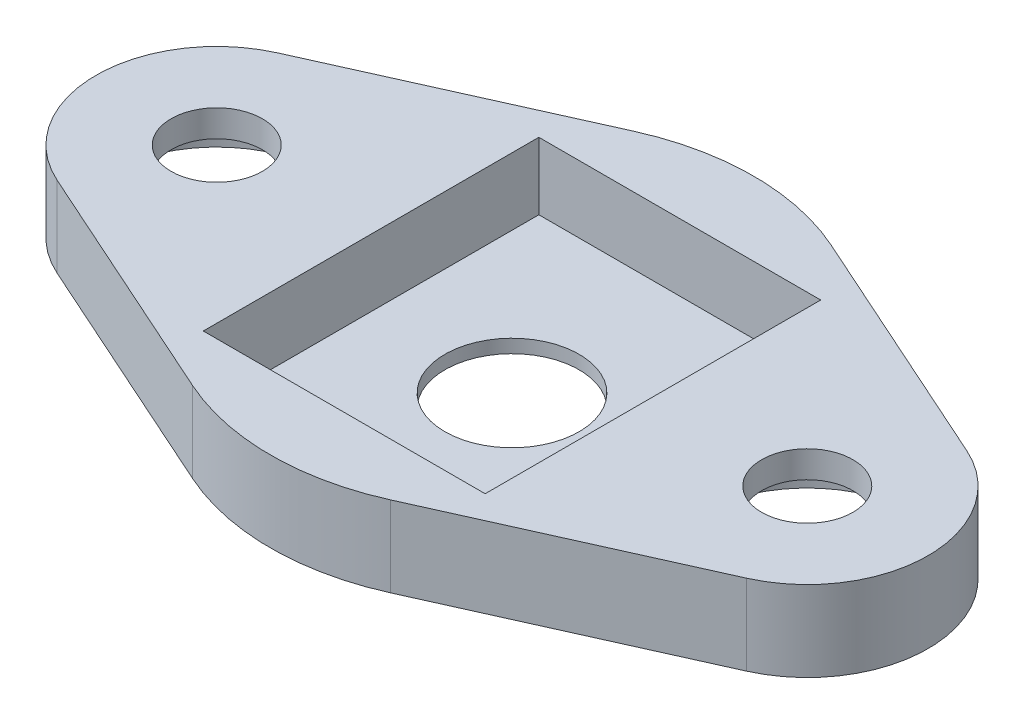
ISO-10303-21;
HEADER;
FILE_DESCRIPTION(('STEP AP214'),'2;1');
FILE_NAME('part.step','',(''),(''),'','','');
FILE_SCHEMA(('AUTOMOTIVE_DESIGN { 1 0 10303 214 1 1 1 1 }'));
ENDSEC;
DATA;
#1=APPLICATION_CONTEXT('core data for automotive mechanical design processes');
#2=APPLICATION_PROTOCOL_DEFINITION('international standard','automotive_design',2000,#1);
#3=PRODUCT_CONTEXT('',#1,'mechanical');
#4=PRODUCT('Part','Part','',(#3));
#5=PRODUCT_RELATED_PRODUCT_CATEGORY('part','',(#4));
#6=PRODUCT_DEFINITION_FORMATION('','',#4);
#7=PRODUCT_DEFINITION_CONTEXT('part definition',#1,'design');
#8=PRODUCT_DEFINITION('design','',#6,#7);
#9=PRODUCT_DEFINITION_SHAPE('','',#8);
#10=(LENGTH_UNIT() NAMED_UNIT(*) SI_UNIT(.MILLI.,.METRE.));
#11=(NAMED_UNIT(*) PLANE_ANGLE_UNIT() SI_UNIT($,.RADIAN.));
#12=(NAMED_UNIT(*) SI_UNIT($,.STERADIAN.) SOLID_ANGLE_UNIT());
#13=UNCERTAINTY_MEASURE_WITH_UNIT(LENGTH_MEASURE(1.E-05),#10,'distance_accuracy_value','');
#14=(GEOMETRIC_REPRESENTATION_CONTEXT(3) GLOBAL_UNCERTAINTY_ASSIGNED_CONTEXT((#13)) GLOBAL_UNIT_ASSIGNED_CONTEXT((#10,
#11,#12)) REPRESENTATION_CONTEXT('',''));
#15=CARTESIAN_POINT('',(0.,0.,0.));
#16=DIRECTION('',(0.,0.,1.));
#17=DIRECTION('',(1.,0.,0.));
#18=AXIS2_PLACEMENT_3D('',#15,#16,#17);
#19=CARTESIAN_POINT('',(-3.68181818181818,3.,-8.21244268631648));
#20=DIRECTION('',(0.409090909090909,0.,0.912493631812942));
#21=DIRECTION('',(0.912493631812942,0.,-0.409090909090909));
#22=AXIS2_PLACEMENT_3D('',#19,#20,#21);
#23=PLANE('',#22);
#24=DIRECTION('',(-0.912493631812942,0.,0.409090909090909));
#25=VECTOR('',#24,1.);
#26=CARTESIAN_POINT('',(-3.68181818181818,0.,-8.21244268631648));
#27=LINE('',#26,#25);
#28=CARTESIAN_POINT('',(-3.68181818181818,0.,-8.21244268631648));
#29=VERTEX_POINT('',#28);
#30=CARTESIAN_POINT('',(-12.8409090909091,0.,-4.10622134315824));
#31=VERTEX_POINT('',#30);
#32=EDGE_CURVE('E279',#29,#31,#27,.T.);
#33=ORIENTED_EDGE('',*,*,#32,.T.);
#34=DIRECTION('',(0.,-1.,0.));
#35=VECTOR('',#34,1.);
#36=CARTESIAN_POINT('',(-12.8409090909091,3.,-4.10622134315824));
#37=LINE('',#36,#35);
#38=CARTESIAN_POINT('',(-12.8409090909091,3.,-4.10622134315824));
#39=VERTEX_POINT('',#38);
#40=EDGE_CURVE('E192',#39,#31,#37,.T.);
#41=ORIENTED_EDGE('',*,*,#40,.F.);
#42=DIRECTION('',(-0.912493631812942,0.,0.409090909090909));
#43=VECTOR('',#42,1.);
#44=CARTESIAN_POINT('',(-3.68181818181818,3.,-8.21244268631648));
#45=LINE('',#44,#43);
#46=CARTESIAN_POINT('',(-3.68181818181818,3.,-8.21244268631648));
#47=VERTEX_POINT('',#46);
#48=EDGE_CURVE('E361',#47,#39,#45,.T.);
#49=ORIENTED_EDGE('',*,*,#48,.F.);
#50=DIRECTION('',(0.,-1.,0.));
#51=VECTOR('',#50,1.);
#52=CARTESIAN_POINT('',(-3.68181818181818,3.,-8.21244268631648));
#53=LINE('',#52,#51);
#54=EDGE_CURVE('E12',#47,#29,#53,.T.);
#55=ORIENTED_EDGE('',*,*,#54,.T.);
#56=EDGE_LOOP('',(#33,#41,#49,#55));
#57=FACE_BOUND('',#56,.T.);
#58=ADVANCED_FACE('F182',(#57),#23,.F.);
#59=CARTESIAN_POINT('',(0.,0.,0.));
#60=DIRECTION('',(0.,1.,0.));
#61=DIRECTION('',(0.,0.,1.));
#62=AXIS2_PLACEMENT_3D('',#59,#60,#61);
#63=PLANE('',#62);
#64=CARTESIAN_POINT('',(-11.,0.,0.));
#65=DIRECTION('',(0.,1.,0.));
#66=DIRECTION('',(0.,0.,1.));
#67=AXIS2_PLACEMENT_3D('',#64,#65,#66);
#68=CIRCLE('',#67,4.15);
#69=CARTESIAN_POINT('',(-11.,0.,4.15));
#70=VERTEX_POINT('',#69);
#71=EDGE_CURVE('E426',#70,#70,#68,.T.);
#72=ORIENTED_EDGE('',*,*,#71,.T.);
#73=EDGE_LOOP('',(#72));
#74=FACE_BOUND('',#73,.T.);
#75=CARTESIAN_POINT('',(11.,0.,0.));
#76=DIRECTION('',(0.,1.,0.));
#77=DIRECTION('',(0.,0.,1.));
#78=AXIS2_PLACEMENT_3D('',#75,#76,#77);
#79=CIRCLE('',#78,4.15);
#80=CARTESIAN_POINT('',(11.,0.,4.15));
#81=VERTEX_POINT('',#80);
#82=EDGE_CURVE('E421',#81,#81,#79,.T.);
#83=ORIENTED_EDGE('',*,*,#82,.T.);
#84=EDGE_LOOP('',(#83));
#85=FACE_BOUND('',#84,.T.);
#86=DIRECTION('',(0.912493631812942,0.,0.409090909090909));
#87=VECTOR('',#86,1.);
#88=CARTESIAN_POINT('',(-3.68181818181818,0.,8.21244268631648));
#89=LINE('',#88,#87);
#90=CARTESIAN_POINT('',(-12.8409090909091,0.,4.10622134315824));
#91=VERTEX_POINT('',#90);
#92=CARTESIAN_POINT('',(-3.68181818181818,0.,8.21244268631648));
#93=VERTEX_POINT('',#92);
#94=EDGE_CURVE('E343',#91,#93,#89,.T.);
#95=ORIENTED_EDGE('',*,*,#94,.F.);
#96=CARTESIAN_POINT('',(-11.,0.,0.));
#97=DIRECTION('',(0.,1.,0.));
#98=DIRECTION('',(0.,0.,1.));
#99=AXIS2_PLACEMENT_3D('',#96,#97,#98);
#100=CIRCLE('',#99,4.5);
#101=EDGE_CURVE('E293',#31,#91,#100,.T.);
#102=ORIENTED_EDGE('',*,*,#101,.F.);
#103=ORIENTED_EDGE('',*,*,#32,.F.);
#104=CARTESIAN_POINT('',(0.,0.,0.));
#105=DIRECTION('',(0.,1.,0.));
#106=DIRECTION('',(0.,0.,1.));
#107=AXIS2_PLACEMENT_3D('',#104,#105,#106);
#108=CIRCLE('',#107,9.);
#109=CARTESIAN_POINT('',(3.68181818181818,0.,-8.21244268631648));
#110=VERTEX_POINT('',#109);
#111=EDGE_CURVE('E259',#110,#29,#108,.T.);
#112=ORIENTED_EDGE('',*,*,#111,.F.);
#113=DIRECTION('',(-0.912493631812943,0.,-0.409090909090908));
#114=VECTOR('',#113,1.);
#115=CARTESIAN_POINT('',(3.68181818181818,0.,-8.21244268631648));
#116=LINE('',#115,#114);
#117=CARTESIAN_POINT('',(12.8409090909091,0.,-4.10622134315825));
#118=VERTEX_POINT('',#117);
#119=EDGE_CURVE('E277',#118,#110,#116,.T.);
#120=ORIENTED_EDGE('',*,*,#119,.F.);
#121=CARTESIAN_POINT('',(11.,0.,0.));
#122=DIRECTION('',(0.,1.,0.));
#123=DIRECTION('',(0.,0.,1.));
#124=AXIS2_PLACEMENT_3D('',#121,#122,#123);
#125=CIRCLE('',#124,4.5);
#126=CARTESIAN_POINT('',(12.8409090909091,0.,4.10622134315824));
#127=VERTEX_POINT('',#126);
#128=EDGE_CURVE('E186',#127,#118,#125,.T.);
#129=ORIENTED_EDGE('',*,*,#128,.F.);
#130=DIRECTION('',(-0.912493631812942,0.,0.409090909090909));
#131=VECTOR('',#130,1.);
#132=CARTESIAN_POINT('',(3.68181818181818,0.,8.21244268631648));
#133=LINE('',#132,#131);
#134=CARTESIAN_POINT('',(3.68181818181818,0.,8.21244268631648));
#135=VERTEX_POINT('',#134);
#136=EDGE_CURVE('E299',#127,#135,#133,.T.);
#137=ORIENTED_EDGE('',*,*,#136,.T.);
#138=EDGE_CURVE('E282',#93,#135,#108,.T.);
#139=ORIENTED_EDGE('',*,*,#138,.F.);
#140=EDGE_LOOP('',(#95,#102,#103,#112,#120,#129,#137,#139));
#141=FACE_BOUND('',#140,.T.);
#142=CARTESIAN_POINT('',(0.,0.,0.));
#143=DIRECTION('',(0.,1.,0.));
#144=DIRECTION('',(0.,0.,1.));
#145=AXIS2_PLACEMENT_3D('',#142,#143,#144);
#146=CIRCLE('',#145,2.5);
#147=CARTESIAN_POINT('',(0.,0.,2.5));
#148=VERTEX_POINT('',#147);
#149=EDGE_CURVE('E306',#148,#148,#146,.T.);
#150=ORIENTED_EDGE('',*,*,#149,.T.);
#151=EDGE_LOOP('',(#150));
#152=FACE_BOUND('',#151,.T.);
#153=ADVANCED_FACE('F274',(#74,#85,#141,#152),#63,.F.);
#154=CARTESIAN_POINT('',(0.,3.,0.));
#155=DIRECTION('',(0.,1.,0.));
#156=DIRECTION('',(0.,0.,1.));
#157=AXIS2_PLACEMENT_3D('',#154,#155,#156);
#158=PLANE('',#157);
#159=DIRECTION('',(-1.,0.,0.));
#160=VECTOR('',#159,1.);
#161=CARTESIAN_POINT('',(0.,3.,-6.25));
#162=LINE('',#161,#160);
#163=CARTESIAN_POINT('',(5.25,3.,-6.25));
#164=VERTEX_POINT('',#163);
#165=CARTESIAN_POINT('',(-5.25,3.,-6.25));
#166=VERTEX_POINT('',#165);
#167=EDGE_CURVE('E200',#164,#166,#162,.T.);
#168=ORIENTED_EDGE('',*,*,#167,.F.);
#169=DIRECTION('',(0.,0.,-1.));
#170=VECTOR('',#169,1.);
#171=CARTESIAN_POINT('',(5.25,3.,0.));
#172=LINE('',#171,#170);
#173=CARTESIAN_POINT('',(5.25,3.,6.25));
#174=VERTEX_POINT('',#173);
#175=EDGE_CURVE('E455',#174,#164,#172,.T.);
#176=ORIENTED_EDGE('',*,*,#175,.F.);
#177=DIRECTION('',(-1.,0.,0.));
#178=VECTOR('',#177,1.);
#179=CARTESIAN_POINT('',(0.,3.,6.25));
#180=LINE('',#179,#178);
#181=CARTESIAN_POINT('',(-5.25,3.,6.25));
#182=VERTEX_POINT('',#181);
#183=EDGE_CURVE('E460',#174,#182,#180,.T.);
#184=ORIENTED_EDGE('',*,*,#183,.T.);
#185=DIRECTION('',(0.,0.,-1.));
#186=VECTOR('',#185,1.);
#187=CARTESIAN_POINT('',(-5.25,3.,0.));
#188=LINE('',#187,#186);
#189=EDGE_CURVE('E464',#182,#166,#188,.T.);
#190=ORIENTED_EDGE('',*,*,#189,.T.);
#191=EDGE_LOOP('',(#168,#176,#184,#190));
#192=FACE_BOUND('',#191,.T.);
#193=ORIENTED_EDGE('',*,*,#48,.T.);
#194=CARTESIAN_POINT('',(-11.,3.,0.));
#195=DIRECTION('',(0.,1.,0.));
#196=DIRECTION('',(0.,0.,1.));
#197=AXIS2_PLACEMENT_3D('',#194,#195,#196);
#198=CIRCLE('',#197,4.5);
#199=CARTESIAN_POINT('',(-12.8409090909091,3.,4.10622134315824));
#200=VERTEX_POINT('',#199);
#201=EDGE_CURVE('E288',#39,#200,#198,.T.);
#202=ORIENTED_EDGE('',*,*,#201,.T.);
#203=DIRECTION('',(0.912493631812942,0.,0.409090909090909));
#204=VECTOR('',#203,1.);
#205=CARTESIAN_POINT('',(-3.68181818181818,3.,8.21244268631648));
#206=LINE('',#205,#204);
#207=CARTESIAN_POINT('',(-3.68181818181818,3.,8.21244268631648));
#208=VERTEX_POINT('',#207);
#209=EDGE_CURVE('E346',#200,#208,#206,.T.);
#210=ORIENTED_EDGE('',*,*,#209,.T.);
#211=CARTESIAN_POINT('',(0.,3.,0.));
#212=DIRECTION('',(0.,1.,0.));
#213=DIRECTION('',(0.,0.,1.));
#214=AXIS2_PLACEMENT_3D('',#211,#212,#213);
#215=CIRCLE('',#214,9.);
#216=CARTESIAN_POINT('',(3.68181818181818,3.,8.21244268631648));
#217=VERTEX_POINT('',#216);
#218=EDGE_CURVE('E281',#208,#217,#215,.T.);
#219=ORIENTED_EDGE('',*,*,#218,.T.);
#220=DIRECTION('',(-0.912493631812942,0.,0.409090909090909));
#221=VECTOR('',#220,1.);
#222=CARTESIAN_POINT('',(3.68181818181818,3.,8.21244268631648));
#223=LINE('',#222,#221);
#224=CARTESIAN_POINT('',(12.8409090909091,3.,4.10622134315824));
#225=VERTEX_POINT('',#224);
#226=EDGE_CURVE('E335',#225,#217,#223,.T.);
#227=ORIENTED_EDGE('',*,*,#226,.F.);
#228=CARTESIAN_POINT('',(11.,3.,0.));
#229=DIRECTION('',(0.,1.,0.));
#230=DIRECTION('',(0.,0.,1.));
#231=AXIS2_PLACEMENT_3D('',#228,#229,#230);
#232=CIRCLE('',#231,4.5);
#233=CARTESIAN_POINT('',(12.8409090909091,3.,-4.10622134315825));
#234=VERTEX_POINT('',#233);
#235=EDGE_CURVE('E310',#225,#234,#232,.T.);
#236=ORIENTED_EDGE('',*,*,#235,.T.);
#237=DIRECTION('',(-0.912493631812943,0.,-0.409090909090908));
#238=VECTOR('',#237,1.);
#239=CARTESIAN_POINT('',(3.68181818181818,3.,-8.21244268631648));
#240=LINE('',#239,#238);
#241=CARTESIAN_POINT('',(3.68181818181818,3.,-8.21244268631648));
#242=VERTEX_POINT('',#241);
#243=EDGE_CURVE('E269',#234,#242,#240,.T.);
#244=ORIENTED_EDGE('',*,*,#243,.T.);
#245=EDGE_CURVE('E262',#242,#47,#215,.T.);
#246=ORIENTED_EDGE('',*,*,#245,.T.);
#247=EDGE_LOOP('',(#193,#202,#210,#219,#227,#236,#244,#246));
#248=FACE_BOUND('',#247,.T.);
#249=CARTESIAN_POINT('',(-11.,3.,0.));
#250=DIRECTION('',(0.,1.,0.));
#251=DIRECTION('',(0.,0.,1.));
#252=AXIS2_PLACEMENT_3D('',#249,#250,#251);
#253=CIRCLE('',#252,1.7);
#254=CARTESIAN_POINT('',(-11.,3.,1.7));
#255=VERTEX_POINT('',#254);
#256=EDGE_CURVE('E300',#255,#255,#253,.T.);
#257=ORIENTED_EDGE('',*,*,#256,.F.);
#258=EDGE_LOOP('',(#257));
#259=FACE_BOUND('',#258,.T.);
#260=CARTESIAN_POINT('',(11.,3.,0.));
#261=DIRECTION('',(0.,1.,0.));
#262=DIRECTION('',(0.,0.,1.));
#263=AXIS2_PLACEMENT_3D('',#260,#261,#262);
#264=CIRCLE('',#263,1.7);
#265=CARTESIAN_POINT('',(11.,3.,1.7));
#266=VERTEX_POINT('',#265);
#267=EDGE_CURVE('E314',#266,#266,#264,.T.);
#268=ORIENTED_EDGE('',*,*,#267,.F.);
#269=EDGE_LOOP('',(#268));
#270=FACE_BOUND('',#269,.T.);
#271=ADVANCED_FACE('F375',(#192,#248,#259,#270),#158,.T.);
#272=CARTESIAN_POINT('',(11.,3.,0.));
#273=DIRECTION('',(0.,-1.,0.));
#274=DIRECTION('',(0.,0.,-1.));
#275=AXIS2_PLACEMENT_3D('',#272,#273,#274);
#276=CYLINDRICAL_SURFACE('',#275,1.7);
#277=CARTESIAN_POINT('',(11.,2.,0.));
#278=DIRECTION('',(0.,1.,0.));
#279=DIRECTION('',(0.,0.,1.));
#280=AXIS2_PLACEMENT_3D('',#277,#278,#279);
#281=CIRCLE('',#280,1.7);
#282=CARTESIAN_POINT('',(11.,2.,1.7));
#283=VERTEX_POINT('',#282);
#284=EDGE_CURVE('E415',#283,#283,#281,.T.);
#285=ORIENTED_EDGE('',*,*,#284,.F.);
#286=EDGE_LOOP('',(#285));
#287=FACE_BOUND('',#286,.T.);
#288=ORIENTED_EDGE('',*,*,#267,.T.);
#289=EDGE_LOOP('',(#288));
#290=FACE_BOUND('',#289,.T.);
#291=ADVANCED_FACE('F404',(#287,#290),#276,.F.);
#292=CARTESIAN_POINT('',(11.,3.,0.));
#293=DIRECTION('',(0.,-1.,0.));
#294=DIRECTION('',(0.,0.,-1.));
#295=AXIS2_PLACEMENT_3D('',#292,#293,#294);
#296=CYLINDRICAL_SURFACE('',#295,4.5);
#297=DIRECTION('',(0.,-1.,0.));
#298=VECTOR('',#297,1.);
#299=CARTESIAN_POINT('',(12.8409090909091,3.,4.10622134315824));
#300=LINE('',#299,#298);
#301=EDGE_CURVE('E324',#225,#127,#300,.T.);
#302=ORIENTED_EDGE('',*,*,#301,.T.);
#303=ORIENTED_EDGE('',*,*,#128,.T.);
#304=DIRECTION('',(0.,-1.,0.));
#305=VECTOR('',#304,1.);
#306=CARTESIAN_POINT('',(12.8409090909091,3.,-4.10622134315825));
#307=LINE('',#306,#305);
#308=EDGE_CURVE('E268',#234,#118,#307,.T.);
#309=ORIENTED_EDGE('',*,*,#308,.F.);
#310=ORIENTED_EDGE('',*,*,#235,.F.);
#311=EDGE_LOOP('',(#302,#303,#309,#310));
#312=FACE_BOUND('',#311,.T.);
#313=ADVANCED_FACE('F184',(#312),#296,.T.);
#314=CARTESIAN_POINT('',(3.68181818181818,3.,8.21244268631648));
#315=DIRECTION('',(0.409090909090909,0.,0.912493631812942));
#316=DIRECTION('',(0.912493631812942,0.,-0.409090909090909));
#317=AXIS2_PLACEMENT_3D('',#314,#315,#316);
#318=PLANE('',#317);
#319=ORIENTED_EDGE('',*,*,#136,.F.);
#320=ORIENTED_EDGE('',*,*,#301,.F.);
#321=ORIENTED_EDGE('',*,*,#226,.T.);
#322=DIRECTION('',(0.,-1.,0.));
#323=VECTOR('',#322,1.);
#324=CARTESIAN_POINT('',(3.68181818181818,3.,8.21244268631648));
#325=LINE('',#324,#323);
#326=EDGE_CURVE('E333',#217,#135,#325,.T.);
#327=ORIENTED_EDGE('',*,*,#326,.T.);
#328=EDGE_LOOP('',(#319,#320,#321,#327));
#329=FACE_BOUND('',#328,.T.);
#330=ADVANCED_FACE('F330',(#329),#318,.T.);
#331=CARTESIAN_POINT('',(-3.68181818181818,3.,8.21244268631648));
#332=DIRECTION('',(0.409090909090909,0.,-0.912493631812942));
#333=DIRECTION('',(-0.912493631812942,0.,-0.409090909090909));
#334=AXIS2_PLACEMENT_3D('',#331,#332,#333);
#335=PLANE('',#334);
#336=ORIENTED_EDGE('',*,*,#94,.T.);
#337=DIRECTION('',(0.,-1.,0.));
#338=VECTOR('',#337,1.);
#339=CARTESIAN_POINT('',(-3.68181818181818,3.,8.21244268631648));
#340=LINE('',#339,#338);
#341=EDGE_CURVE('E352',#208,#93,#340,.T.);
#342=ORIENTED_EDGE('',*,*,#341,.F.);
#343=ORIENTED_EDGE('',*,*,#209,.F.);
#344=DIRECTION('',(0.,-1.,0.));
#345=VECTOR('',#344,1.);
#346=CARTESIAN_POINT('',(-12.8409090909091,3.,4.10622134315824));
#347=LINE('',#346,#345);
#348=EDGE_CURVE('E356',#200,#91,#347,.T.);
#349=ORIENTED_EDGE('',*,*,#348,.T.);
#350=EDGE_LOOP('',(#336,#342,#343,#349));
#351=FACE_BOUND('',#350,.T.);
#352=ADVANCED_FACE('F374',(#351),#335,.F.);
#353=CARTESIAN_POINT('',(3.68181818181818,3.,-8.21244268631648));
#354=DIRECTION('',(-0.409090909090908,0.,0.912493631812943));
#355=DIRECTION('',(0.912493631812943,0.,0.409090909090908));
#356=AXIS2_PLACEMENT_3D('',#353,#354,#355);
#357=PLANE('',#356);
#358=ORIENTED_EDGE('',*,*,#119,.T.);
#359=DIRECTION('',(0.,-1.,0.));
#360=VECTOR('',#359,1.);
#361=CARTESIAN_POINT('',(3.68181818181818,3.,-8.21244268631648));
#362=LINE('',#361,#360);
#363=EDGE_CURVE('E256',#242,#110,#362,.T.);
#364=ORIENTED_EDGE('',*,*,#363,.F.);
#365=ORIENTED_EDGE('',*,*,#243,.F.);
#366=ORIENTED_EDGE('',*,*,#308,.T.);
#367=EDGE_LOOP('',(#358,#364,#365,#366));
#368=FACE_BOUND('',#367,.T.);
#369=ADVANCED_FACE('F285',(#368),#357,.F.);
#370=CARTESIAN_POINT('',(0.,3.,0.));
#371=DIRECTION('',(0.,-1.,0.));
#372=DIRECTION('',(0.,0.,-1.));
#373=AXIS2_PLACEMENT_3D('',#370,#371,#372);
#374=CYLINDRICAL_SURFACE('',#373,2.5);
#375=CARTESIAN_POINT('',(0.,0.5,0.));
#376=DIRECTION('',(0.,1.,0.));
#377=DIRECTION('',(0.,0.,1.));
#378=AXIS2_PLACEMENT_3D('',#375,#376,#377);
#379=CIRCLE('',#378,2.5);
#380=CARTESIAN_POINT('',(0.,0.5,2.5));
#381=VERTEX_POINT('',#380);
#382=EDGE_CURVE('E470',#381,#381,#379,.T.);
#383=ORIENTED_EDGE('',*,*,#382,.T.);
#384=EDGE_LOOP('',(#383));
#385=FACE_BOUND('',#384,.T.);
#386=ORIENTED_EDGE('',*,*,#149,.F.);
#387=EDGE_LOOP('',(#386));
#388=FACE_BOUND('',#387,.T.);
#389=ADVANCED_FACE('F392',(#385,#388),#374,.F.);
#390=CARTESIAN_POINT('',(0.,3.,0.));
#391=DIRECTION('',(0.,-1.,0.));
#392=DIRECTION('',(0.,0.,-1.));
#393=AXIS2_PLACEMENT_3D('',#390,#391,#392);
#394=CYLINDRICAL_SURFACE('',#393,9.);
#395=ORIENTED_EDGE('',*,*,#218,.F.);
#396=ORIENTED_EDGE('',*,*,#341,.T.);
#397=ORIENTED_EDGE('',*,*,#138,.T.);
#398=ORIENTED_EDGE('',*,*,#326,.F.);
#399=EDGE_LOOP('',(#395,#396,#397,#398));
#400=FACE_BOUND('',#399,.T.);
#401=ADVANCED_FACE('F373',(#400),#394,.T.);
#402=ORIENTED_EDGE('',*,*,#111,.T.);
#403=ORIENTED_EDGE('',*,*,#54,.F.);
#404=ORIENTED_EDGE('',*,*,#245,.F.);
#405=ORIENTED_EDGE('',*,*,#363,.T.);
#406=EDGE_LOOP('',(#402,#403,#404,#405));
#407=FACE_BOUND('',#406,.T.);
#408=ADVANCED_FACE('F258',(#407),#394,.T.);
#409=CARTESIAN_POINT('',(-11.,3.,0.));
#410=DIRECTION('',(0.,-1.,0.));
#411=DIRECTION('',(0.,0.,-1.));
#412=AXIS2_PLACEMENT_3D('',#409,#410,#411);
#413=CYLINDRICAL_SURFACE('',#412,1.7);
#414=CARTESIAN_POINT('',(-11.,2.,0.));
#415=DIRECTION('',(0.,1.,0.));
#416=DIRECTION('',(0.,0.,1.));
#417=AXIS2_PLACEMENT_3D('',#414,#415,#416);
#418=CIRCLE('',#417,1.7);
#419=CARTESIAN_POINT('',(-11.,2.,1.7));
#420=VERTEX_POINT('',#419);
#421=EDGE_CURVE('E317',#420,#420,#418,.T.);
#422=ORIENTED_EDGE('',*,*,#421,.F.);
#423=EDGE_LOOP('',(#422));
#424=FACE_BOUND('',#423,.T.);
#425=ORIENTED_EDGE('',*,*,#256,.T.);
#426=EDGE_LOOP('',(#425));
#427=FACE_BOUND('',#426,.T.);
#428=ADVANCED_FACE('F393',(#424,#427),#413,.F.);
#429=CARTESIAN_POINT('',(-11.,3.,0.));
#430=DIRECTION('',(0.,-1.,0.));
#431=DIRECTION('',(0.,0.,-1.));
#432=AXIS2_PLACEMENT_3D('',#429,#430,#431);
#433=CYLINDRICAL_SURFACE('',#432,4.5);
#434=ORIENTED_EDGE('',*,*,#40,.T.);
#435=ORIENTED_EDGE('',*,*,#101,.T.);
#436=ORIENTED_EDGE('',*,*,#348,.F.);
#437=ORIENTED_EDGE('',*,*,#201,.F.);
#438=EDGE_LOOP('',(#434,#435,#436,#437));
#439=FACE_BOUND('',#438,.T.);
#440=ADVANCED_FACE('F370',(#439),#433,.T.);
#441=CARTESIAN_POINT('',(-11.,2.,0.));
#442=DIRECTION('',(0.,-1.,0.));
#443=DIRECTION('',(0.,0.,-1.));
#444=AXIS2_PLACEMENT_3D('',#441,#442,#443);
#445=CYLINDRICAL_SURFACE('',#444,4.15);
#446=CARTESIAN_POINT('',(-11.,2.,0.));
#447=DIRECTION('',(0.,1.,0.));
#448=DIRECTION('',(0.,0.,1.));
#449=AXIS2_PLACEMENT_3D('',#446,#447,#448);
#450=CIRCLE('',#449,4.15);
#451=CARTESIAN_POINT('',(-11.,2.,4.15));
#452=VERTEX_POINT('',#451);
#453=EDGE_CURVE('E434',#452,#452,#450,.T.);
#454=ORIENTED_EDGE('',*,*,#453,.T.);
#455=EDGE_LOOP('',(#454));
#456=FACE_BOUND('',#455,.T.);
#457=ORIENTED_EDGE('',*,*,#71,.F.);
#458=EDGE_LOOP('',(#457));
#459=FACE_BOUND('',#458,.T.);
#460=ADVANCED_FACE('F399',(#456,#459),#445,.F.);
#461=CARTESIAN_POINT('',(0.,2.,0.));
#462=DIRECTION('',(0.,1.,0.));
#463=DIRECTION('',(0.,0.,1.));
#464=AXIS2_PLACEMENT_3D('',#461,#462,#463);
#465=PLANE('',#464);
#466=ORIENTED_EDGE('',*,*,#453,.F.);
#467=EDGE_LOOP('',(#466));
#468=FACE_BOUND('',#467,.T.);
#469=ORIENTED_EDGE('',*,*,#421,.T.);
#470=EDGE_LOOP('',(#469));
#471=FACE_BOUND('',#470,.T.);
#472=ADVANCED_FACE('F534',(#468,#471),#465,.F.);
#473=CARTESIAN_POINT('',(11.,2.,0.));
#474=DIRECTION('',(0.,-1.,0.));
#475=DIRECTION('',(0.,0.,-1.));
#476=AXIS2_PLACEMENT_3D('',#473,#474,#475);
#477=CYLINDRICAL_SURFACE('',#476,4.15);
#478=CARTESIAN_POINT('',(11.,2.,0.));
#479=DIRECTION('',(0.,1.,0.));
#480=DIRECTION('',(0.,0.,1.));
#481=AXIS2_PLACEMENT_3D('',#478,#479,#480);
#482=CIRCLE('',#481,4.15);
#483=CARTESIAN_POINT('',(11.,2.,4.15));
#484=VERTEX_POINT('',#483);
#485=EDGE_CURVE('E420',#484,#484,#482,.T.);
#486=ORIENTED_EDGE('',*,*,#485,.T.);
#487=EDGE_LOOP('',(#486));
#488=FACE_BOUND('',#487,.T.);
#489=ORIENTED_EDGE('',*,*,#82,.F.);
#490=EDGE_LOOP('',(#489));
#491=FACE_BOUND('',#490,.T.);
#492=ADVANCED_FACE('F537',(#488,#491),#477,.F.);
#493=CARTESIAN_POINT('',(0.,2.,0.));
#494=DIRECTION('',(0.,1.,0.));
#495=DIRECTION('',(0.,0.,1.));
#496=AXIS2_PLACEMENT_3D('',#493,#494,#495);
#497=PLANE('',#496);
#498=ORIENTED_EDGE('',*,*,#284,.T.);
#499=EDGE_LOOP('',(#498));
#500=FACE_BOUND('',#499,.T.);
#501=ORIENTED_EDGE('',*,*,#485,.F.);
#502=EDGE_LOOP('',(#501));
#503=FACE_BOUND('',#502,.T.);
#504=ADVANCED_FACE('F533',(#500,#503),#497,.F.);
#505=CARTESIAN_POINT('',(0.,0.5,-6.25));
#506=DIRECTION('',(0.,0.,-1.));
#507=DIRECTION('',(-1.,0.,0.));
#508=AXIS2_PLACEMENT_3D('',#505,#506,#507);
#509=PLANE('',#508);
#510=ORIENTED_EDGE('',*,*,#167,.T.);
#511=DIRECTION('',(0.,1.,0.));
#512=VECTOR('',#511,1.);
#513=CARTESIAN_POINT('',(-5.25,0.5,-6.25));
#514=LINE('',#513,#512);
#515=CARTESIAN_POINT('',(-5.25,0.5,-6.25));
#516=VERTEX_POINT('',#515);
#517=EDGE_CURVE('E441',#516,#166,#514,.T.);
#518=ORIENTED_EDGE('',*,*,#517,.F.);
#519=DIRECTION('',(-1.,0.,0.));
#520=VECTOR('',#519,1.);
#521=CARTESIAN_POINT('',(0.,0.5,-6.25));
#522=LINE('',#521,#520);
#523=CARTESIAN_POINT('',(5.25,0.5,-6.25));
#524=VERTEX_POINT('',#523);
#525=EDGE_CURVE('E459',#524,#516,#522,.T.);
#526=ORIENTED_EDGE('',*,*,#525,.F.);
#527=DIRECTION('',(0.,1.,0.));
#528=VECTOR('',#527,1.);
#529=CARTESIAN_POINT('',(5.25,0.5,-6.25));
#530=LINE('',#529,#528);
#531=EDGE_CURVE('E429',#524,#164,#530,.T.);
#532=ORIENTED_EDGE('',*,*,#531,.T.);
#533=EDGE_LOOP('',(#510,#518,#526,#532));
#534=FACE_BOUND('',#533,.T.);
#535=ADVANCED_FACE('F503',(#534),#509,.F.);
#536=CARTESIAN_POINT('',(5.25,0.5,0.));
#537=DIRECTION('',(1.,0.,0.));
#538=DIRECTION('',(0.,0.,-1.));
#539=AXIS2_PLACEMENT_3D('',#536,#537,#538);
#540=PLANE('',#539);
#541=ORIENTED_EDGE('',*,*,#175,.T.);
#542=ORIENTED_EDGE('',*,*,#531,.F.);
#543=DIRECTION('',(0.,0.,-1.));
#544=VECTOR('',#543,1.);
#545=CARTESIAN_POINT('',(5.25,0.5,0.));
#546=LINE('',#545,#544);
#547=CARTESIAN_POINT('',(5.25,0.5,6.25));
#548=VERTEX_POINT('',#547);
#549=EDGE_CURVE('E445',#548,#524,#546,.T.);
#550=ORIENTED_EDGE('',*,*,#549,.F.);
#551=DIRECTION('',(0.,1.,0.));
#552=VECTOR('',#551,1.);
#553=CARTESIAN_POINT('',(5.25,0.5,6.25));
#554=LINE('',#553,#552);
#555=EDGE_CURVE('E449',#548,#174,#554,.T.);
#556=ORIENTED_EDGE('',*,*,#555,.T.);
#557=EDGE_LOOP('',(#541,#542,#550,#556));
#558=FACE_BOUND('',#557,.T.);
#559=ADVANCED_FACE('F516',(#558),#540,.F.);
#560=CARTESIAN_POINT('',(0.,0.5,6.25));
#561=DIRECTION('',(0.,0.,-1.));
#562=DIRECTION('',(-1.,0.,0.));
#563=AXIS2_PLACEMENT_3D('',#560,#561,#562);
#564=PLANE('',#563);
#565=ORIENTED_EDGE('',*,*,#183,.F.);
#566=ORIENTED_EDGE('',*,*,#555,.F.);
#567=DIRECTION('',(-1.,0.,0.));
#568=VECTOR('',#567,1.);
#569=CARTESIAN_POINT('',(0.,0.5,6.25));
#570=LINE('',#569,#568);
#571=CARTESIAN_POINT('',(-5.25,0.5,6.25));
#572=VERTEX_POINT('',#571);
#573=EDGE_CURVE('E474',#548,#572,#570,.T.);
#574=ORIENTED_EDGE('',*,*,#573,.T.);
#575=DIRECTION('',(0.,1.,0.));
#576=VECTOR('',#575,1.);
#577=CARTESIAN_POINT('',(-5.25,0.5,6.25));
#578=LINE('',#577,#576);
#579=EDGE_CURVE('E444',#572,#182,#578,.T.);
#580=ORIENTED_EDGE('',*,*,#579,.T.);
#581=EDGE_LOOP('',(#565,#566,#574,#580));
#582=FACE_BOUND('',#581,.T.);
#583=ADVANCED_FACE('F519',(#582),#564,.T.);
#584=CARTESIAN_POINT('',(-5.25,0.5,0.));
#585=DIRECTION('',(1.,0.,0.));
#586=DIRECTION('',(0.,0.,-1.));
#587=AXIS2_PLACEMENT_3D('',#584,#585,#586);
#588=PLANE('',#587);
#589=ORIENTED_EDGE('',*,*,#189,.F.);
#590=ORIENTED_EDGE('',*,*,#579,.F.);
#591=DIRECTION('',(0.,0.,-1.));
#592=VECTOR('',#591,1.);
#593=CARTESIAN_POINT('',(-5.25,0.5,0.));
#594=LINE('',#593,#592);
#595=EDGE_CURVE('E478',#572,#516,#594,.T.);
#596=ORIENTED_EDGE('',*,*,#595,.T.);
#597=ORIENTED_EDGE('',*,*,#517,.T.);
#598=EDGE_LOOP('',(#589,#590,#596,#597));
#599=FACE_BOUND('',#598,.T.);
#600=ADVANCED_FACE('F493',(#599),#588,.T.);
#601=CARTESIAN_POINT('',(0.,0.5,0.));
#602=DIRECTION('',(0.,-1.,0.));
#603=DIRECTION('',(0.,0.,-1.));
#604=AXIS2_PLACEMENT_3D('',#601,#602,#603);
#605=PLANE('',#604);
#606=ORIENTED_EDGE('',*,*,#382,.F.);
#607=EDGE_LOOP('',(#606));
#608=FACE_BOUND('',#607,.T.);
#609=ORIENTED_EDGE('',*,*,#525,.T.);
#610=ORIENTED_EDGE('',*,*,#595,.F.);
#611=ORIENTED_EDGE('',*,*,#573,.F.);
#612=ORIENTED_EDGE('',*,*,#549,.T.);
#613=EDGE_LOOP('',(#609,#610,#611,#612));
#614=FACE_BOUND('',#613,.T.);
#615=ADVANCED_FACE('F490',(#608,#614),#605,.F.);
#616=CLOSED_SHELL('',(#58,#153,#271,#291,#313,#330,#352,#369,#389,#401,#408,#428,#440,#460,#472,
#492,#504,#535,#559,#583,#600,#615));
#617=MANIFOLD_SOLID_BREP('B2',#616);
#618=ADVANCED_BREP_SHAPE_REPRESENTATION('',(#18,#617),#14);
#619=SHAPE_DEFINITION_REPRESENTATION(#9,#618);
ENDSEC;
END-ISO-10303-21;
